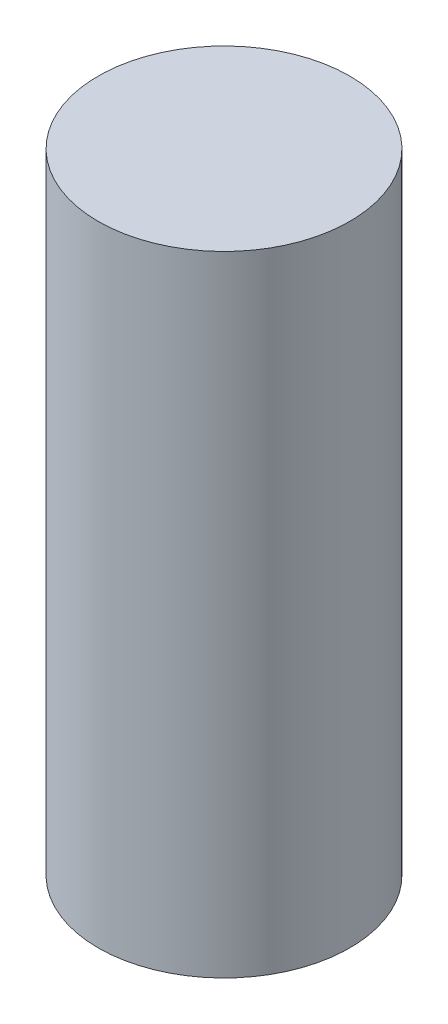
ISO-10303-21;
HEADER;
FILE_DESCRIPTION(('STEP AP214'),'2;1');
FILE_NAME('part.step','',(''),(''),'','','');
FILE_SCHEMA(('AUTOMOTIVE_DESIGN { 1 0 10303 214 1 1 1 1 }'));
ENDSEC;
DATA;
#1=APPLICATION_CONTEXT('core data for automotive mechanical design processes');
#2=APPLICATION_PROTOCOL_DEFINITION('international standard','automotive_design',2000,#1);
#3=PRODUCT_CONTEXT('',#1,'mechanical');
#4=PRODUCT('Part','Part','',(#3));
#5=PRODUCT_RELATED_PRODUCT_CATEGORY('part','',(#4));
#6=PRODUCT_DEFINITION_FORMATION('','',#4);
#7=PRODUCT_DEFINITION_CONTEXT('part definition',#1,'design');
#8=PRODUCT_DEFINITION('design','',#6,#7);
#9=PRODUCT_DEFINITION_SHAPE('','',#8);
#10=(LENGTH_UNIT() NAMED_UNIT(*) SI_UNIT(.MILLI.,.METRE.));
#11=(NAMED_UNIT(*) PLANE_ANGLE_UNIT() SI_UNIT($,.RADIAN.));
#12=(NAMED_UNIT(*) SI_UNIT($,.STERADIAN.) SOLID_ANGLE_UNIT());
#13=UNCERTAINTY_MEASURE_WITH_UNIT(LENGTH_MEASURE(1.E-05),#10,'distance_accuracy_value','');
#14=(GEOMETRIC_REPRESENTATION_CONTEXT(3) GLOBAL_UNCERTAINTY_ASSIGNED_CONTEXT((#13)) GLOBAL_UNIT_ASSIGNED_CONTEXT((#10,
#11,#12)) REPRESENTATION_CONTEXT('',''));
#15=CARTESIAN_POINT('',(0.,0.,0.));
#16=DIRECTION('',(0.,0.,1.));
#17=DIRECTION('',(1.,0.,0.));
#18=AXIS2_PLACEMENT_3D('',#15,#16,#17);
#19=CARTESIAN_POINT('',(0.,30.,0.));
#20=DIRECTION('',(0.,-1.,0.));
#21=DIRECTION('',(0.,0.,-1.));
#22=AXIS2_PLACEMENT_3D('',#19,#20,#21);
#23=CYLINDRICAL_SURFACE('',#22,7.);
#24=CARTESIAN_POINT('',(0.,0.,0.));
#25=DIRECTION('',(0.,1.,0.));
#26=DIRECTION('',(0.,0.,1.));
#27=AXIS2_PLACEMENT_3D('',#24,#25,#26);
#28=CIRCLE('',#27,7.);
#29=CARTESIAN_POINT('',(0.,0.,7.));
#30=VERTEX_POINT('',#29);
#31=EDGE_CURVE('E10',#30,#30,#28,.T.);
#32=ORIENTED_EDGE('',*,*,#31,.T.);
#33=EDGE_LOOP('',(#32));
#34=FACE_BOUND('',#33,.T.);
#35=CARTESIAN_POINT('',(0.,35.,0.));
#36=DIRECTION('',(0.,1.,0.));
#37=DIRECTION('',(0.,0.,1.));
#38=AXIS2_PLACEMENT_3D('',#35,#36,#37);
#39=CIRCLE('',#38,7.);
#40=CARTESIAN_POINT('',(0.,35.,7.));
#41=VERTEX_POINT('',#40);
#42=EDGE_CURVE('E48',#41,#41,#39,.T.);
#43=ORIENTED_EDGE('',*,*,#42,.F.);
#44=EDGE_LOOP('',(#43));
#45=FACE_BOUND('',#44,.T.);
#46=ADVANCED_FACE('F41',(#34,#45),#23,.T.);
#47=CARTESIAN_POINT('',(0.,0.,0.));
#48=DIRECTION('',(0.,1.,0.));
#49=DIRECTION('',(0.,0.,1.));
#50=AXIS2_PLACEMENT_3D('',#47,#48,#49);
#51=PLANE('',#50);
#52=ORIENTED_EDGE('',*,*,#31,.F.);
#53=EDGE_LOOP('',(#52));
#54=FACE_BOUND('',#53,.T.);
#55=ADVANCED_FACE('F58',(#54),#51,.F.);
#56=CARTESIAN_POINT('',(0.,35.,0.));
#57=DIRECTION('',(0.,1.,0.));
#58=DIRECTION('',(0.,0.,1.));
#59=AXIS2_PLACEMENT_3D('',#56,#57,#58);
#60=PLANE('',#59);
#61=ORIENTED_EDGE('',*,*,#42,.T.);
#62=EDGE_LOOP('',(#61));
#63=FACE_BOUND('',#62,.T.);
#64=ADVANCED_FACE('F55',(#63),#60,.T.);
#65=CLOSED_SHELL('',(#46,#55,#64));
#66=MANIFOLD_SOLID_BREP('B2',#65);
#67=ADVANCED_BREP_SHAPE_REPRESENTATION('',(#18,#66),#14);
#68=SHAPE_DEFINITION_REPRESENTATION(#9,#67);
ENDSEC;
END-ISO-10303-21;
